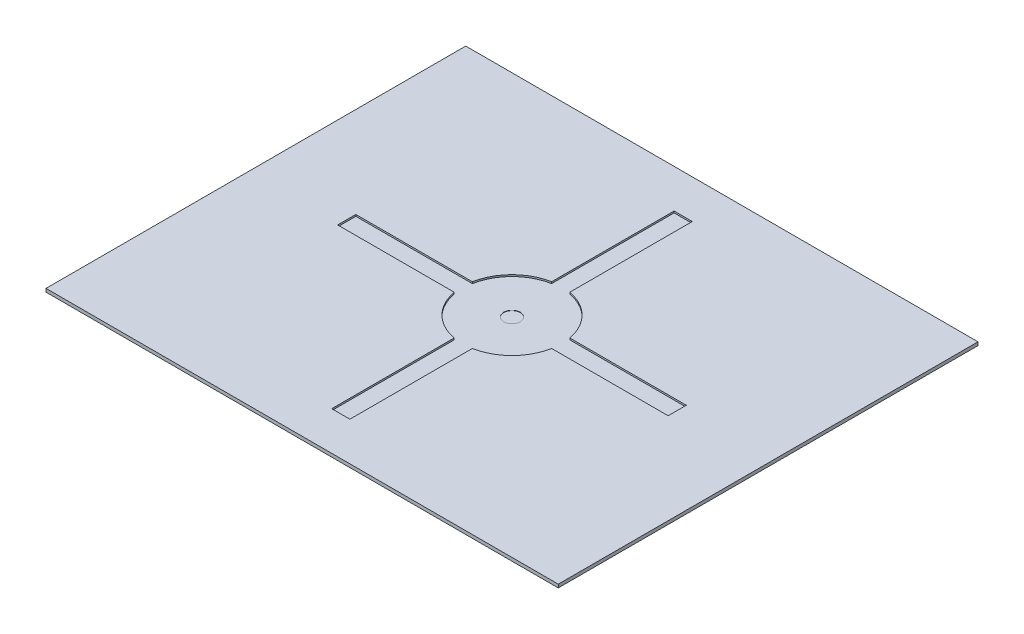
ISO-10303-21;
HEADER;
FILE_DESCRIPTION(('STEP AP214'),'2;1');
FILE_NAME('part.step','',(''),(''),'','','');
FILE_SCHEMA(('AUTOMOTIVE_DESIGN { 1 0 10303 214 1 1 1 1 }'));
ENDSEC;
DATA;
#1=APPLICATION_CONTEXT('core data for automotive mechanical design processes');
#2=APPLICATION_PROTOCOL_DEFINITION('international standard','automotive_design',2000,#1);
#3=PRODUCT_CONTEXT('',#1,'mechanical');
#4=PRODUCT('Part','Part','',(#3));
#5=PRODUCT_RELATED_PRODUCT_CATEGORY('part','',(#4));
#6=PRODUCT_DEFINITION_FORMATION('','',#4);
#7=PRODUCT_DEFINITION_CONTEXT('part definition',#1,'design');
#8=PRODUCT_DEFINITION('design','',#6,#7);
#9=PRODUCT_DEFINITION_SHAPE('','',#8);
#10=(LENGTH_UNIT() NAMED_UNIT(*) SI_UNIT(.MILLI.,.METRE.));
#11=(NAMED_UNIT(*) PLANE_ANGLE_UNIT() SI_UNIT($,.RADIAN.));
#12=(NAMED_UNIT(*) SI_UNIT($,.STERADIAN.) SOLID_ANGLE_UNIT());
#13=UNCERTAINTY_MEASURE_WITH_UNIT(LENGTH_MEASURE(1.E-05),#10,'distance_accuracy_value','');
#14=(GEOMETRIC_REPRESENTATION_CONTEXT(3) GLOBAL_UNCERTAINTY_ASSIGNED_CONTEXT((#13)) GLOBAL_UNIT_ASSIGNED_CONTEXT((#10,
#11,#12)) REPRESENTATION_CONTEXT('',''));
#15=CARTESIAN_POINT('',(0.,0.,0.));
#16=DIRECTION('',(0.,0.,1.));
#17=DIRECTION('',(1.,0.,0.));
#18=AXIS2_PLACEMENT_3D('',#15,#16,#17);
#19=CARTESIAN_POINT('',(77.5,1.,-63.5));
#20=DIRECTION('',(-1.,0.,0.));
#21=DIRECTION('',(0.,0.,1.));
#22=AXIS2_PLACEMENT_3D('',#19,#20,#21);
#23=PLANE('',#22);
#24=DIRECTION('',(0.,0.,-1.));
#25=VECTOR('',#24,1.);
#26=CARTESIAN_POINT('',(77.5,0.,-63.5));
#27=LINE('',#26,#25);
#28=CARTESIAN_POINT('',(77.5,0.,63.5));
#29=VERTEX_POINT('',#28);
#30=CARTESIAN_POINT('',(77.5,0.,-63.5));
#31=VERTEX_POINT('',#30);
#32=EDGE_CURVE('E289',#29,#31,#27,.T.);
#33=ORIENTED_EDGE('',*,*,#32,.T.);
#34=DIRECTION('',(0.,-1.,0.));
#35=VECTOR('',#34,1.);
#36=CARTESIAN_POINT('',(77.5,1.,-63.5));
#37=LINE('',#36,#35);
#38=CARTESIAN_POINT('',(77.5,1.,-63.5));
#39=VERTEX_POINT('',#38);
#40=EDGE_CURVE('E11',#39,#31,#37,.T.);
#41=ORIENTED_EDGE('',*,*,#40,.F.);
#42=DIRECTION('',(0.,0.,-1.));
#43=VECTOR('',#42,1.);
#44=CARTESIAN_POINT('',(77.5,1.,-63.5));
#45=LINE('',#44,#43);
#46=CARTESIAN_POINT('',(77.5,1.,63.5));
#47=VERTEX_POINT('',#46);
#48=EDGE_CURVE('E317',#47,#39,#45,.T.);
#49=ORIENTED_EDGE('',*,*,#48,.F.);
#50=DIRECTION('',(0.,-1.,0.));
#51=VECTOR('',#50,1.);
#52=CARTESIAN_POINT('',(77.5,1.,63.5));
#53=LINE('',#52,#51);
#54=EDGE_CURVE('E323',#47,#29,#53,.T.);
#55=ORIENTED_EDGE('',*,*,#54,.T.);
#56=EDGE_LOOP('',(#33,#41,#49,#55));
#57=FACE_BOUND('',#56,.T.);
#58=ADVANCED_FACE('F33',(#57),#23,.F.);
#59=CARTESIAN_POINT('',(-77.5,1.,-63.5));
#60=DIRECTION('',(0.,0.,1.));
#61=DIRECTION('',(1.,0.,0.));
#62=AXIS2_PLACEMENT_3D('',#59,#60,#61);
#63=PLANE('',#62);
#64=DIRECTION('',(-1.,0.,0.));
#65=VECTOR('',#64,1.);
#66=CARTESIAN_POINT('',(-77.5,0.,-63.5));
#67=LINE('',#66,#65);
#68=CARTESIAN_POINT('',(-77.5,0.,-63.5));
#69=VERTEX_POINT('',#68);
#70=EDGE_CURVE('E326',#31,#69,#67,.T.);
#71=ORIENTED_EDGE('',*,*,#70,.T.);
#72=DIRECTION('',(0.,-1.,0.));
#73=VECTOR('',#72,1.);
#74=CARTESIAN_POINT('',(-77.5,1.,-63.5));
#75=LINE('',#74,#73);
#76=CARTESIAN_POINT('',(-77.5,1.,-63.5));
#77=VERTEX_POINT('',#76);
#78=EDGE_CURVE('E40',#77,#69,#75,.T.);
#79=ORIENTED_EDGE('',*,*,#78,.F.);
#80=DIRECTION('',(-1.,0.,0.));
#81=VECTOR('',#80,1.);
#82=CARTESIAN_POINT('',(-77.5,1.,-63.5));
#83=LINE('',#82,#81);
#84=EDGE_CURVE('E84',#39,#77,#83,.T.);
#85=ORIENTED_EDGE('',*,*,#84,.F.);
#86=ORIENTED_EDGE('',*,*,#40,.T.);
#87=EDGE_LOOP('',(#71,#79,#85,#86));
#88=FACE_BOUND('',#87,.T.);
#89=ADVANCED_FACE('F356',(#88),#63,.F.);
#90=CARTESIAN_POINT('',(-77.5,1.,-63.5));
#91=DIRECTION('',(1.,0.,0.));
#92=DIRECTION('',(0.,0.,-1.));
#93=AXIS2_PLACEMENT_3D('',#90,#91,#92);
#94=PLANE('',#93);
#95=DIRECTION('',(0.,0.,1.));
#96=VECTOR('',#95,1.);
#97=CARTESIAN_POINT('',(-77.5,0.,-63.5));
#98=LINE('',#97,#96);
#99=CARTESIAN_POINT('',(-77.5,0.,63.5));
#100=VERTEX_POINT('',#99);
#101=EDGE_CURVE('E328',#69,#100,#98,.T.);
#102=ORIENTED_EDGE('',*,*,#101,.T.);
#103=DIRECTION('',(0.,-1.,0.));
#104=VECTOR('',#103,1.);
#105=CARTESIAN_POINT('',(-77.5,1.,63.5));
#106=LINE('',#105,#104);
#107=CARTESIAN_POINT('',(-77.5,1.,63.5));
#108=VERTEX_POINT('',#107);
#109=EDGE_CURVE('E332',#108,#100,#106,.T.);
#110=ORIENTED_EDGE('',*,*,#109,.F.);
#111=DIRECTION('',(0.,0.,1.));
#112=VECTOR('',#111,1.);
#113=CARTESIAN_POINT('',(-77.5,1.,-63.5));
#114=LINE('',#113,#112);
#115=EDGE_CURVE('E320',#77,#108,#114,.T.);
#116=ORIENTED_EDGE('',*,*,#115,.F.);
#117=ORIENTED_EDGE('',*,*,#78,.T.);
#118=EDGE_LOOP('',(#102,#110,#116,#117));
#119=FACE_BOUND('',#118,.T.);
#120=ADVANCED_FACE('F337',(#119),#94,.F.);
#121=CARTESIAN_POINT('',(-77.5,1.,63.5));
#122=DIRECTION('',(0.,0.,-1.));
#123=DIRECTION('',(-1.,0.,0.));
#124=AXIS2_PLACEMENT_3D('',#121,#122,#123);
#125=PLANE('',#124);
#126=DIRECTION('',(1.,0.,0.));
#127=VECTOR('',#126,1.);
#128=CARTESIAN_POINT('',(-77.5,0.,63.5));
#129=LINE('',#128,#127);
#130=EDGE_CURVE('E77',#100,#29,#129,.T.);
#131=ORIENTED_EDGE('',*,*,#130,.T.);
#132=ORIENTED_EDGE('',*,*,#54,.F.);
#133=DIRECTION('',(1.,0.,0.));
#134=VECTOR('',#133,1.);
#135=CARTESIAN_POINT('',(-77.5,1.,63.5));
#136=LINE('',#135,#134);
#137=EDGE_CURVE('E56',#108,#47,#136,.T.);
#138=ORIENTED_EDGE('',*,*,#137,.F.);
#139=ORIENTED_EDGE('',*,*,#109,.T.);
#140=EDGE_LOOP('',(#131,#132,#138,#139));
#141=FACE_BOUND('',#140,.T.);
#142=ADVANCED_FACE('F345',(#141),#125,.F.);
#143=CARTESIAN_POINT('',(0.,1.,0.));
#144=DIRECTION('',(0.,1.,0.));
#145=DIRECTION('',(0.,0.,1.));
#146=AXIS2_PLACEMENT_3D('',#143,#144,#145);
#147=PLANE('',#146);
#148=DIRECTION('',(1.,0.,0.));
#149=VECTOR('',#148,1.);
#150=CARTESIAN_POINT('',(14.7457621030586,1.,2.75));
#151=LINE('',#150,#149);
#152=CARTESIAN_POINT('',(14.7457621030586,1.,2.75));
#153=VERTEX_POINT('',#152);
#154=CARTESIAN_POINT('',(50.,1.,2.75));
#155=VERTEX_POINT('',#154);
#156=EDGE_CURVE('E47',#153,#155,#151,.T.);
#157=ORIENTED_EDGE('',*,*,#156,.F.);
#158=CARTESIAN_POINT('',(0.,1.,0.));
#159=DIRECTION('',(0.,1.,0.));
#160=DIRECTION('',(0.,0.,1.));
#161=AXIS2_PLACEMENT_3D('',#158,#159,#160);
#162=CIRCLE('',#161,15.);
#163=CARTESIAN_POINT('',(2.75,1.,14.7457621030586));
#164=VERTEX_POINT('',#163);
#165=EDGE_CURVE('E199',#164,#153,#162,.T.);
#166=ORIENTED_EDGE('',*,*,#165,.F.);
#167=DIRECTION('',(0.,0.,-1.));
#168=VECTOR('',#167,1.);
#169=CARTESIAN_POINT('',(2.75,1.,14.7457621030586));
#170=LINE('',#169,#168);
#171=CARTESIAN_POINT('',(2.75000000000001,1.,51.7988498967456));
#172=VERTEX_POINT('',#171);
#173=EDGE_CURVE('E202',#172,#164,#170,.T.);
#174=ORIENTED_EDGE('',*,*,#173,.F.);
#175=DIRECTION('',(1.,0.,0.));
#176=VECTOR('',#175,1.);
#177=CARTESIAN_POINT('',(-2.74999999999999,1.,51.7988498967456));
#178=LINE('',#177,#176);
#179=CARTESIAN_POINT('',(-2.74999999999999,1.,51.7988498967456));
#180=VERTEX_POINT('',#179);
#181=EDGE_CURVE('E282',#180,#172,#178,.T.);
#182=ORIENTED_EDGE('',*,*,#181,.F.);
#183=DIRECTION('',(0.,0.,1.));
#184=VECTOR('',#183,1.);
#185=CARTESIAN_POINT('',(-2.75,1.,14.7457621030586));
#186=LINE('',#185,#184);
#187=CARTESIAN_POINT('',(-2.75000000000001,1.,14.7457621030586));
#188=VERTEX_POINT('',#187);
#189=EDGE_CURVE('E279',#188,#180,#186,.T.);
#190=ORIENTED_EDGE('',*,*,#189,.F.);
#191=CARTESIAN_POINT('',(0.,1.,0.));
#192=DIRECTION('',(0.,1.,0.));
#193=DIRECTION('',(0.,0.,1.));
#194=AXIS2_PLACEMENT_3D('',#191,#192,#193);
#195=CIRCLE('',#194,15.);
#196=CARTESIAN_POINT('',(-14.7457621030586,1.,2.75));
#197=VERTEX_POINT('',#196);
#198=EDGE_CURVE('E276',#197,#188,#195,.T.);
#199=ORIENTED_EDGE('',*,*,#198,.F.);
#200=DIRECTION('',(1.,0.,0.));
#201=VECTOR('',#200,1.);
#202=CARTESIAN_POINT('',(-50.,1.,2.75));
#203=LINE('',#202,#201);
#204=CARTESIAN_POINT('',(-50.,1.,2.75));
#205=VERTEX_POINT('',#204);
#206=EDGE_CURVE('E273',#205,#197,#203,.T.);
#207=ORIENTED_EDGE('',*,*,#206,.F.);
#208=DIRECTION('',(0.,0.,1.));
#209=VECTOR('',#208,1.);
#210=CARTESIAN_POINT('',(-50.,1.,-2.75));
#211=LINE('',#210,#209);
#212=CARTESIAN_POINT('',(-50.,1.,-2.75));
#213=VERTEX_POINT('',#212);
#214=EDGE_CURVE('E270',#213,#205,#211,.T.);
#215=ORIENTED_EDGE('',*,*,#214,.F.);
#216=DIRECTION('',(-1.,0.,0.));
#217=VECTOR('',#216,1.);
#218=CARTESIAN_POINT('',(-50.,1.,-2.75));
#219=LINE('',#218,#217);
#220=CARTESIAN_POINT('',(-14.7457621030586,1.,-2.75));
#221=VERTEX_POINT('',#220);
#222=EDGE_CURVE('E267',#221,#213,#219,.T.);
#223=ORIENTED_EDGE('',*,*,#222,.F.);
#224=CARTESIAN_POINT('',(0.,1.,0.));
#225=DIRECTION('',(0.,1.,0.));
#226=DIRECTION('',(0.,0.,1.));
#227=AXIS2_PLACEMENT_3D('',#224,#225,#226);
#228=CIRCLE('',#227,15.);
#229=CARTESIAN_POINT('',(-2.75,1.,-14.7457621030586));
#230=VERTEX_POINT('',#229);
#231=EDGE_CURVE('E264',#230,#221,#228,.T.);
#232=ORIENTED_EDGE('',*,*,#231,.F.);
#233=DIRECTION('',(0.,0.,1.));
#234=VECTOR('',#233,1.);
#235=CARTESIAN_POINT('',(-2.75000000000001,1.,-51.7988498967456));
#236=LINE('',#235,#234);
#237=CARTESIAN_POINT('',(-2.75000000000001,1.,-51.7988498967456));
#238=VERTEX_POINT('',#237);
#239=EDGE_CURVE('E261',#238,#230,#236,.T.);
#240=ORIENTED_EDGE('',*,*,#239,.F.);
#241=DIRECTION('',(-1.,0.,0.));
#242=VECTOR('',#241,1.);
#243=CARTESIAN_POINT('',(-2.75000000000001,1.,-51.7988498967456));
#244=LINE('',#243,#242);
#245=CARTESIAN_POINT('',(2.74999999999999,1.,-51.7988498967456));
#246=VERTEX_POINT('',#245);
#247=EDGE_CURVE('E258',#246,#238,#244,.T.);
#248=ORIENTED_EDGE('',*,*,#247,.F.);
#249=DIRECTION('',(0.,0.,-1.));
#250=VECTOR('',#249,1.);
#251=CARTESIAN_POINT('',(2.74999999999999,1.,-51.7988498967456));
#252=LINE('',#251,#250);
#253=CARTESIAN_POINT('',(2.75,1.,-14.7457621030586));
#254=VERTEX_POINT('',#253);
#255=EDGE_CURVE('E255',#254,#246,#252,.T.);
#256=ORIENTED_EDGE('',*,*,#255,.F.);
#257=CARTESIAN_POINT('',(0.,1.,0.));
#258=DIRECTION('',(0.,1.,0.));
#259=DIRECTION('',(0.,0.,1.));
#260=AXIS2_PLACEMENT_3D('',#257,#258,#259);
#261=CIRCLE('',#260,15.);
#262=CARTESIAN_POINT('',(14.7457621030586,1.,-2.75));
#263=VERTEX_POINT('',#262);
#264=EDGE_CURVE('E252',#263,#254,#261,.T.);
#265=ORIENTED_EDGE('',*,*,#264,.F.);
#266=DIRECTION('',(-1.,0.,0.));
#267=VECTOR('',#266,1.);
#268=CARTESIAN_POINT('',(14.7457621030586,1.,-2.75));
#269=LINE('',#268,#267);
#270=CARTESIAN_POINT('',(50.,1.,-2.75));
#271=VERTEX_POINT('',#270);
#272=EDGE_CURVE('E249',#271,#263,#269,.T.);
#273=ORIENTED_EDGE('',*,*,#272,.F.);
#274=DIRECTION('',(0.,0.,-1.));
#275=VECTOR('',#274,1.);
#276=CARTESIAN_POINT('',(50.,1.,-2.75));
#277=LINE('',#276,#275);
#278=EDGE_CURVE('E246',#155,#271,#277,.T.);
#279=ORIENTED_EDGE('',*,*,#278,.F.);
#280=EDGE_LOOP('',(#157,#166,#174,#182,#190,#199,#207,#215,#223,#232,#240,#248,#256,#265,#273,#279));
#281=FACE_BOUND('',#280,.T.);
#282=ORIENTED_EDGE('',*,*,#48,.T.);
#283=ORIENTED_EDGE('',*,*,#84,.T.);
#284=ORIENTED_EDGE('',*,*,#115,.T.);
#285=ORIENTED_EDGE('',*,*,#137,.T.);
#286=EDGE_LOOP('',(#282,#283,#284,#285));
#287=FACE_BOUND('',#286,.T.);
#288=ADVANCED_FACE('F347',(#281,#287),#147,.T.);
#289=CARTESIAN_POINT('',(0.,0.,0.));
#290=DIRECTION('',(0.,1.,0.));
#291=DIRECTION('',(0.,0.,1.));
#292=AXIS2_PLACEMENT_3D('',#289,#290,#291);
#293=PLANE('',#292);
#294=ORIENTED_EDGE('',*,*,#32,.F.);
#295=ORIENTED_EDGE('',*,*,#130,.F.);
#296=ORIENTED_EDGE('',*,*,#101,.F.);
#297=ORIENTED_EDGE('',*,*,#70,.F.);
#298=EDGE_LOOP('',(#294,#295,#296,#297));
#299=FACE_BOUND('',#298,.T.);
#300=ADVANCED_FACE('F341',(#299),#293,.F.);
#301=CARTESIAN_POINT('',(14.7457621030586,0.5,2.75));
#302=DIRECTION('',(0.,0.,1.));
#303=DIRECTION('',(1.,0.,0.));
#304=AXIS2_PLACEMENT_3D('',#301,#302,#303);
#305=PLANE('',#304);
#306=ORIENTED_EDGE('',*,*,#156,.T.);
#307=DIRECTION('',(0.,1.,0.));
#308=VECTOR('',#307,1.);
#309=CARTESIAN_POINT('',(50.,0.5,2.75));
#310=LINE('',#309,#308);
#311=CARTESIAN_POINT('',(50.,0.5,2.75));
#312=VERTEX_POINT('',#311);
#313=EDGE_CURVE('E176',#312,#155,#310,.T.);
#314=ORIENTED_EDGE('',*,*,#313,.F.);
#315=DIRECTION('',(1.,0.,0.));
#316=VECTOR('',#315,1.);
#317=CARTESIAN_POINT('',(14.7457621030586,0.5,2.75));
#318=LINE('',#317,#316);
#319=CARTESIAN_POINT('',(14.7457621030586,0.5,2.75));
#320=VERTEX_POINT('',#319);
#321=EDGE_CURVE('E180',#320,#312,#318,.T.);
#322=ORIENTED_EDGE('',*,*,#321,.F.);
#323=DIRECTION('',(0.,1.,0.));
#324=VECTOR('',#323,1.);
#325=CARTESIAN_POINT('',(14.7457621030586,0.5,2.75));
#326=LINE('',#325,#324);
#327=EDGE_CURVE('E287',#320,#153,#326,.T.);
#328=ORIENTED_EDGE('',*,*,#327,.T.);
#329=EDGE_LOOP('',(#306,#314,#322,#328));
#330=FACE_BOUND('',#329,.T.);
#331=ADVANCED_FACE('F178',(#330),#305,.F.);
#332=CARTESIAN_POINT('',(0.,0.5,0.));
#333=DIRECTION('',(0.,1.,0.));
#334=DIRECTION('',(0.,0.,1.));
#335=AXIS2_PLACEMENT_3D('',#332,#333,#334);
#336=CYLINDRICAL_SURFACE('',#335,15.);
#337=ORIENTED_EDGE('',*,*,#165,.T.);
#338=ORIENTED_EDGE('',*,*,#327,.F.);
#339=CARTESIAN_POINT('',(0.,0.5,0.));
#340=DIRECTION('',(0.,1.,0.));
#341=DIRECTION('',(0.,0.,1.));
#342=AXIS2_PLACEMENT_3D('',#339,#340,#341);
#343=CIRCLE('',#342,15.);
#344=CARTESIAN_POINT('',(2.75,0.5,14.7457621030586));
#345=VERTEX_POINT('',#344);
#346=EDGE_CURVE('E186',#345,#320,#343,.T.);
#347=ORIENTED_EDGE('',*,*,#346,.F.);
#348=DIRECTION('',(0.,1.,0.));
#349=VECTOR('',#348,1.);
#350=CARTESIAN_POINT('',(2.75,0.5,14.7457621030586));
#351=LINE('',#350,#349);
#352=EDGE_CURVE('E290',#345,#164,#351,.T.);
#353=ORIENTED_EDGE('',*,*,#352,.T.);
#354=EDGE_LOOP('',(#337,#338,#347,#353));
#355=FACE_BOUND('',#354,.T.);
#356=ADVANCED_FACE('F392',(#355),#336,.F.);
#357=CARTESIAN_POINT('',(2.75,0.5,14.7457621030586));
#358=DIRECTION('',(1.,0.,0.));
#359=DIRECTION('',(0.,0.,-1.));
#360=AXIS2_PLACEMENT_3D('',#357,#358,#359);
#361=PLANE('',#360);
#362=ORIENTED_EDGE('',*,*,#173,.T.);
#363=ORIENTED_EDGE('',*,*,#352,.F.);
#364=DIRECTION('',(0.,0.,-1.));
#365=VECTOR('',#364,1.);
#366=CARTESIAN_POINT('',(2.75,0.5,14.7457621030586));
#367=LINE('',#366,#365);
#368=CARTESIAN_POINT('',(2.75000000000001,0.5,51.7988498967456));
#369=VERTEX_POINT('',#368);
#370=EDGE_CURVE('E242',#369,#345,#367,.T.);
#371=ORIENTED_EDGE('',*,*,#370,.F.);
#372=DIRECTION('',(0.,1.,0.));
#373=VECTOR('',#372,1.);
#374=CARTESIAN_POINT('',(2.75000000000001,0.5,51.7988498967456));
#375=LINE('',#374,#373);
#376=EDGE_CURVE('E292',#369,#172,#375,.T.);
#377=ORIENTED_EDGE('',*,*,#376,.T.);
#378=EDGE_LOOP('',(#362,#363,#371,#377));
#379=FACE_BOUND('',#378,.T.);
#380=ADVANCED_FACE('F401',(#379),#361,.F.);
#381=CARTESIAN_POINT('',(-2.74999999999999,0.5,51.7988498967456));
#382=DIRECTION('',(0.,0.,1.));
#383=DIRECTION('',(1.,0.,0.));
#384=AXIS2_PLACEMENT_3D('',#381,#382,#383);
#385=PLANE('',#384);
#386=ORIENTED_EDGE('',*,*,#181,.T.);
#387=ORIENTED_EDGE('',*,*,#376,.F.);
#388=DIRECTION('',(1.,0.,0.));
#389=VECTOR('',#388,1.);
#390=CARTESIAN_POINT('',(-2.74999999999999,0.5,51.7988498967456));
#391=LINE('',#390,#389);
#392=CARTESIAN_POINT('',(-2.74999999999999,0.5,51.7988498967456));
#393=VERTEX_POINT('',#392);
#394=EDGE_CURVE('E239',#393,#369,#391,.T.);
#395=ORIENTED_EDGE('',*,*,#394,.F.);
#396=DIRECTION('',(0.,1.,0.));
#397=VECTOR('',#396,1.);
#398=CARTESIAN_POINT('',(-2.74999999999999,0.5,51.7988498967456));
#399=LINE('',#398,#397);
#400=EDGE_CURVE('E294',#393,#180,#399,.T.);
#401=ORIENTED_EDGE('',*,*,#400,.T.);
#402=EDGE_LOOP('',(#386,#387,#395,#401));
#403=FACE_BOUND('',#402,.T.);
#404=ADVANCED_FACE('F411',(#403),#385,.F.);
#405=CARTESIAN_POINT('',(-2.75,0.5,14.7457621030586));
#406=DIRECTION('',(-1.,0.,0.));
#407=DIRECTION('',(0.,0.,1.));
#408=AXIS2_PLACEMENT_3D('',#405,#406,#407);
#409=PLANE('',#408);
#410=ORIENTED_EDGE('',*,*,#189,.T.);
#411=ORIENTED_EDGE('',*,*,#400,.F.);
#412=DIRECTION('',(0.,0.,1.));
#413=VECTOR('',#412,1.);
#414=CARTESIAN_POINT('',(-2.75,0.5,14.7457621030586));
#415=LINE('',#414,#413);
#416=CARTESIAN_POINT('',(-2.75000000000001,0.5,14.7457621030586));
#417=VERTEX_POINT('',#416);
#418=EDGE_CURVE('E236',#417,#393,#415,.T.);
#419=ORIENTED_EDGE('',*,*,#418,.F.);
#420=DIRECTION('',(0.,1.,0.));
#421=VECTOR('',#420,1.);
#422=CARTESIAN_POINT('',(-2.75000000000001,0.5,14.7457621030586));
#423=LINE('',#422,#421);
#424=EDGE_CURVE('E296',#417,#188,#423,.T.);
#425=ORIENTED_EDGE('',*,*,#424,.T.);
#426=EDGE_LOOP('',(#410,#411,#419,#425));
#427=FACE_BOUND('',#426,.T.);
#428=ADVANCED_FACE('F421',(#427),#409,.F.);
#429=CARTESIAN_POINT('',(0.,0.5,0.));
#430=DIRECTION('',(0.,1.,0.));
#431=DIRECTION('',(0.,0.,1.));
#432=AXIS2_PLACEMENT_3D('',#429,#430,#431);
#433=CYLINDRICAL_SURFACE('',#432,15.);
#434=ORIENTED_EDGE('',*,*,#198,.T.);
#435=ORIENTED_EDGE('',*,*,#424,.F.);
#436=CARTESIAN_POINT('',(0.,0.5,0.));
#437=DIRECTION('',(0.,1.,0.));
#438=DIRECTION('',(0.,0.,1.));
#439=AXIS2_PLACEMENT_3D('',#436,#437,#438);
#440=CIRCLE('',#439,15.);
#441=CARTESIAN_POINT('',(-14.7457621030586,0.5,2.75));
#442=VERTEX_POINT('',#441);
#443=EDGE_CURVE('E233',#442,#417,#440,.T.);
#444=ORIENTED_EDGE('',*,*,#443,.F.);
#445=DIRECTION('',(0.,1.,0.));
#446=VECTOR('',#445,1.);
#447=CARTESIAN_POINT('',(-14.7457621030586,0.5,2.75));
#448=LINE('',#447,#446);
#449=EDGE_CURVE('E298',#442,#197,#448,.T.);
#450=ORIENTED_EDGE('',*,*,#449,.T.);
#451=EDGE_LOOP('',(#434,#435,#444,#450));
#452=FACE_BOUND('',#451,.T.);
#453=ADVANCED_FACE('F431',(#452),#433,.F.);
#454=CARTESIAN_POINT('',(-50.,0.5,2.75));
#455=DIRECTION('',(0.,0.,1.));
#456=DIRECTION('',(1.,0.,0.));
#457=AXIS2_PLACEMENT_3D('',#454,#455,#456);
#458=PLANE('',#457);
#459=ORIENTED_EDGE('',*,*,#206,.T.);
#460=ORIENTED_EDGE('',*,*,#449,.F.);
#461=DIRECTION('',(1.,0.,0.));
#462=VECTOR('',#461,1.);
#463=CARTESIAN_POINT('',(-50.,0.5,2.75));
#464=LINE('',#463,#462);
#465=CARTESIAN_POINT('',(-50.,0.5,2.75));
#466=VERTEX_POINT('',#465);
#467=EDGE_CURVE('E230',#466,#442,#464,.T.);
#468=ORIENTED_EDGE('',*,*,#467,.F.);
#469=DIRECTION('',(0.,1.,0.));
#470=VECTOR('',#469,1.);
#471=CARTESIAN_POINT('',(-50.,0.5,2.75));
#472=LINE('',#471,#470);
#473=EDGE_CURVE('E300',#466,#205,#472,.T.);
#474=ORIENTED_EDGE('',*,*,#473,.T.);
#475=EDGE_LOOP('',(#459,#460,#468,#474));
#476=FACE_BOUND('',#475,.T.);
#477=ADVANCED_FACE('F441',(#476),#458,.F.);
#478=CARTESIAN_POINT('',(-50.,0.5,-2.75));
#479=DIRECTION('',(-1.,0.,0.));
#480=DIRECTION('',(0.,0.,1.));
#481=AXIS2_PLACEMENT_3D('',#478,#479,#480);
#482=PLANE('',#481);
#483=ORIENTED_EDGE('',*,*,#214,.T.);
#484=ORIENTED_EDGE('',*,*,#473,.F.);
#485=DIRECTION('',(0.,0.,1.));
#486=VECTOR('',#485,1.);
#487=CARTESIAN_POINT('',(-50.,0.5,-2.75));
#488=LINE('',#487,#486);
#489=CARTESIAN_POINT('',(-50.,0.5,-2.75));
#490=VERTEX_POINT('',#489);
#491=EDGE_CURVE('E227',#490,#466,#488,.T.);
#492=ORIENTED_EDGE('',*,*,#491,.F.);
#493=DIRECTION('',(0.,1.,0.));
#494=VECTOR('',#493,1.);
#495=CARTESIAN_POINT('',(-50.,0.5,-2.75));
#496=LINE('',#495,#494);
#497=EDGE_CURVE('E302',#490,#213,#496,.T.);
#498=ORIENTED_EDGE('',*,*,#497,.T.);
#499=EDGE_LOOP('',(#483,#484,#492,#498));
#500=FACE_BOUND('',#499,.T.);
#501=ADVANCED_FACE('F451',(#500),#482,.F.);
#502=CARTESIAN_POINT('',(-50.,0.5,-2.75));
#503=DIRECTION('',(0.,0.,-1.));
#504=DIRECTION('',(-1.,0.,0.));
#505=AXIS2_PLACEMENT_3D('',#502,#503,#504);
#506=PLANE('',#505);
#507=ORIENTED_EDGE('',*,*,#222,.T.);
#508=ORIENTED_EDGE('',*,*,#497,.F.);
#509=DIRECTION('',(-1.,0.,0.));
#510=VECTOR('',#509,1.);
#511=CARTESIAN_POINT('',(-50.,0.5,-2.75));
#512=LINE('',#511,#510);
#513=CARTESIAN_POINT('',(-14.7457621030586,0.5,-2.75));
#514=VERTEX_POINT('',#513);
#515=EDGE_CURVE('E224',#514,#490,#512,.T.);
#516=ORIENTED_EDGE('',*,*,#515,.F.);
#517=DIRECTION('',(0.,1.,0.));
#518=VECTOR('',#517,1.);
#519=CARTESIAN_POINT('',(-14.7457621030586,0.5,-2.75));
#520=LINE('',#519,#518);
#521=EDGE_CURVE('E304',#514,#221,#520,.T.);
#522=ORIENTED_EDGE('',*,*,#521,.T.);
#523=EDGE_LOOP('',(#507,#508,#516,#522));
#524=FACE_BOUND('',#523,.T.);
#525=ADVANCED_FACE('F461',(#524),#506,.F.);
#526=CARTESIAN_POINT('',(0.,0.5,0.));
#527=DIRECTION('',(0.,1.,0.));
#528=DIRECTION('',(0.,0.,1.));
#529=AXIS2_PLACEMENT_3D('',#526,#527,#528);
#530=CYLINDRICAL_SURFACE('',#529,15.);
#531=ORIENTED_EDGE('',*,*,#231,.T.);
#532=ORIENTED_EDGE('',*,*,#521,.F.);
#533=CARTESIAN_POINT('',(0.,0.5,0.));
#534=DIRECTION('',(0.,1.,0.));
#535=DIRECTION('',(0.,0.,1.));
#536=AXIS2_PLACEMENT_3D('',#533,#534,#535);
#537=CIRCLE('',#536,15.);
#538=CARTESIAN_POINT('',(-2.75,0.5,-14.7457621030586));
#539=VERTEX_POINT('',#538);
#540=EDGE_CURVE('E221',#539,#514,#537,.T.);
#541=ORIENTED_EDGE('',*,*,#540,.F.);
#542=DIRECTION('',(0.,1.,0.));
#543=VECTOR('',#542,1.);
#544=CARTESIAN_POINT('',(-2.75,0.5,-14.7457621030586));
#545=LINE('',#544,#543);
#546=EDGE_CURVE('E306',#539,#230,#545,.T.);
#547=ORIENTED_EDGE('',*,*,#546,.T.);
#548=EDGE_LOOP('',(#531,#532,#541,#547));
#549=FACE_BOUND('',#548,.T.);
#550=ADVANCED_FACE('F471',(#549),#530,.F.);
#551=CARTESIAN_POINT('',(-2.75000000000001,0.5,-51.7988498967456));
#552=DIRECTION('',(-1.,0.,0.));
#553=DIRECTION('',(0.,0.,1.));
#554=AXIS2_PLACEMENT_3D('',#551,#552,#553);
#555=PLANE('',#554);
#556=ORIENTED_EDGE('',*,*,#239,.T.);
#557=ORIENTED_EDGE('',*,*,#546,.F.);
#558=DIRECTION('',(0.,0.,1.));
#559=VECTOR('',#558,1.);
#560=CARTESIAN_POINT('',(-2.75000000000001,0.5,-51.7988498967456));
#561=LINE('',#560,#559);
#562=CARTESIAN_POINT('',(-2.75000000000001,0.5,-51.7988498967456));
#563=VERTEX_POINT('',#562);
#564=EDGE_CURVE('E218',#563,#539,#561,.T.);
#565=ORIENTED_EDGE('',*,*,#564,.F.);
#566=DIRECTION('',(0.,1.,0.));
#567=VECTOR('',#566,1.);
#568=CARTESIAN_POINT('',(-2.75000000000001,0.5,-51.7988498967456));
#569=LINE('',#568,#567);
#570=EDGE_CURVE('E308',#563,#238,#569,.T.);
#571=ORIENTED_EDGE('',*,*,#570,.T.);
#572=EDGE_LOOP('',(#556,#557,#565,#571));
#573=FACE_BOUND('',#572,.T.);
#574=ADVANCED_FACE('F481',(#573),#555,.F.);
#575=CARTESIAN_POINT('',(-2.75000000000001,0.5,-51.7988498967456));
#576=DIRECTION('',(0.,0.,-1.));
#577=DIRECTION('',(-1.,0.,0.));
#578=AXIS2_PLACEMENT_3D('',#575,#576,#577);
#579=PLANE('',#578);
#580=ORIENTED_EDGE('',*,*,#247,.T.);
#581=ORIENTED_EDGE('',*,*,#570,.F.);
#582=DIRECTION('',(-1.,0.,0.));
#583=VECTOR('',#582,1.);
#584=CARTESIAN_POINT('',(-2.75000000000001,0.5,-51.7988498967456));
#585=LINE('',#584,#583);
#586=CARTESIAN_POINT('',(2.74999999999999,0.5,-51.7988498967456));
#587=VERTEX_POINT('',#586);
#588=EDGE_CURVE('E215',#587,#563,#585,.T.);
#589=ORIENTED_EDGE('',*,*,#588,.F.);
#590=DIRECTION('',(0.,1.,0.));
#591=VECTOR('',#590,1.);
#592=CARTESIAN_POINT('',(2.74999999999999,0.5,-51.7988498967456));
#593=LINE('',#592,#591);
#594=EDGE_CURVE('E310',#587,#246,#593,.T.);
#595=ORIENTED_EDGE('',*,*,#594,.T.);
#596=EDGE_LOOP('',(#580,#581,#589,#595));
#597=FACE_BOUND('',#596,.T.);
#598=ADVANCED_FACE('F491',(#597),#579,.F.);
#599=CARTESIAN_POINT('',(2.74999999999999,0.5,-51.7988498967456));
#600=DIRECTION('',(1.,0.,0.));
#601=DIRECTION('',(0.,0.,-1.));
#602=AXIS2_PLACEMENT_3D('',#599,#600,#601);
#603=PLANE('',#602);
#604=ORIENTED_EDGE('',*,*,#255,.T.);
#605=ORIENTED_EDGE('',*,*,#594,.F.);
#606=DIRECTION('',(0.,0.,-1.));
#607=VECTOR('',#606,1.);
#608=CARTESIAN_POINT('',(2.74999999999999,0.5,-51.7988498967456));
#609=LINE('',#608,#607);
#610=CARTESIAN_POINT('',(2.75,0.5,-14.7457621030586));
#611=VERTEX_POINT('',#610);
#612=EDGE_CURVE('E212',#611,#587,#609,.T.);
#613=ORIENTED_EDGE('',*,*,#612,.F.);
#614=DIRECTION('',(0.,1.,0.));
#615=VECTOR('',#614,1.);
#616=CARTESIAN_POINT('',(2.75,0.5,-14.7457621030586));
#617=LINE('',#616,#615);
#618=EDGE_CURVE('E312',#611,#254,#617,.T.);
#619=ORIENTED_EDGE('',*,*,#618,.T.);
#620=EDGE_LOOP('',(#604,#605,#613,#619));
#621=FACE_BOUND('',#620,.T.);
#622=ADVANCED_FACE('F501',(#621),#603,.F.);
#623=CARTESIAN_POINT('',(0.,0.5,0.));
#624=DIRECTION('',(0.,1.,0.));
#625=DIRECTION('',(0.,0.,1.));
#626=AXIS2_PLACEMENT_3D('',#623,#624,#625);
#627=CYLINDRICAL_SURFACE('',#626,15.);
#628=ORIENTED_EDGE('',*,*,#264,.T.);
#629=ORIENTED_EDGE('',*,*,#618,.F.);
#630=CARTESIAN_POINT('',(0.,0.5,0.));
#631=DIRECTION('',(0.,1.,0.));
#632=DIRECTION('',(0.,0.,1.));
#633=AXIS2_PLACEMENT_3D('',#630,#631,#632);
#634=CIRCLE('',#633,15.);
#635=CARTESIAN_POINT('',(14.7457621030586,0.5,-2.75));
#636=VERTEX_POINT('',#635);
#637=EDGE_CURVE('E209',#636,#611,#634,.T.);
#638=ORIENTED_EDGE('',*,*,#637,.F.);
#639=DIRECTION('',(0.,1.,0.));
#640=VECTOR('',#639,1.);
#641=CARTESIAN_POINT('',(14.7457621030586,0.5,-2.75));
#642=LINE('',#641,#640);
#643=EDGE_CURVE('E314',#636,#263,#642,.T.);
#644=ORIENTED_EDGE('',*,*,#643,.T.);
#645=EDGE_LOOP('',(#628,#629,#638,#644));
#646=FACE_BOUND('',#645,.T.);
#647=ADVANCED_FACE('F511',(#646),#627,.F.);
#648=CARTESIAN_POINT('',(14.7457621030586,0.5,-2.75));
#649=DIRECTION('',(0.,0.,-1.));
#650=DIRECTION('',(-1.,0.,0.));
#651=AXIS2_PLACEMENT_3D('',#648,#649,#650);
#652=PLANE('',#651);
#653=ORIENTED_EDGE('',*,*,#272,.T.);
#654=ORIENTED_EDGE('',*,*,#643,.F.);
#655=DIRECTION('',(-1.,0.,0.));
#656=VECTOR('',#655,1.);
#657=CARTESIAN_POINT('',(14.7457621030586,0.5,-2.75));
#658=LINE('',#657,#656);
#659=CARTESIAN_POINT('',(50.,0.5,-2.75));
#660=VERTEX_POINT('',#659);
#661=EDGE_CURVE('E194',#660,#636,#658,.T.);
#662=ORIENTED_EDGE('',*,*,#661,.F.);
#663=DIRECTION('',(0.,1.,0.));
#664=VECTOR('',#663,1.);
#665=CARTESIAN_POINT('',(50.,0.5,-2.75));
#666=LINE('',#665,#664);
#667=EDGE_CURVE('E185',#660,#271,#666,.T.);
#668=ORIENTED_EDGE('',*,*,#667,.T.);
#669=EDGE_LOOP('',(#653,#654,#662,#668));
#670=FACE_BOUND('',#669,.T.);
#671=ADVANCED_FACE('F521',(#670),#652,.F.);
#672=CARTESIAN_POINT('',(50.,0.5,-2.75));
#673=DIRECTION('',(1.,0.,0.));
#674=DIRECTION('',(0.,0.,-1.));
#675=AXIS2_PLACEMENT_3D('',#672,#673,#674);
#676=PLANE('',#675);
#677=ORIENTED_EDGE('',*,*,#278,.T.);
#678=ORIENTED_EDGE('',*,*,#667,.F.);
#679=DIRECTION('',(0.,0.,-1.));
#680=VECTOR('',#679,1.);
#681=CARTESIAN_POINT('',(50.,0.5,-2.75));
#682=LINE('',#681,#680);
#683=EDGE_CURVE('E189',#312,#660,#682,.T.);
#684=ORIENTED_EDGE('',*,*,#683,.F.);
#685=ORIENTED_EDGE('',*,*,#313,.T.);
#686=EDGE_LOOP('',(#677,#678,#684,#685));
#687=FACE_BOUND('',#686,.T.);
#688=ADVANCED_FACE('F190',(#687),#676,.F.);
#689=CARTESIAN_POINT('',(0.,0.5,0.));
#690=DIRECTION('',(0.,1.,0.));
#691=DIRECTION('',(0.,0.,1.));
#692=AXIS2_PLACEMENT_3D('',#689,#690,#691);
#693=PLANE('',#692);
#694=CARTESIAN_POINT('',(0.,0.5,0.));
#695=DIRECTION('',(0.,1.,0.));
#696=DIRECTION('',(0.,0.,1.));
#697=AXIS2_PLACEMENT_3D('',#694,#695,#696);
#698=CIRCLE('',#697,2.5);
#699=CARTESIAN_POINT('',(0.,0.5,2.5));
#700=VERTEX_POINT('',#699);
#701=EDGE_CURVE('E205',#700,#700,#698,.T.);
#702=ORIENTED_EDGE('',*,*,#701,.F.);
#703=EDGE_LOOP('',(#702));
#704=FACE_BOUND('',#703,.T.);
#705=ORIENTED_EDGE('',*,*,#321,.T.);
#706=ORIENTED_EDGE('',*,*,#683,.T.);
#707=ORIENTED_EDGE('',*,*,#661,.T.);
#708=ORIENTED_EDGE('',*,*,#637,.T.);
#709=ORIENTED_EDGE('',*,*,#612,.T.);
#710=ORIENTED_EDGE('',*,*,#588,.T.);
#711=ORIENTED_EDGE('',*,*,#564,.T.);
#712=ORIENTED_EDGE('',*,*,#540,.T.);
#713=ORIENTED_EDGE('',*,*,#515,.T.);
#714=ORIENTED_EDGE('',*,*,#491,.T.);
#715=ORIENTED_EDGE('',*,*,#467,.T.);
#716=ORIENTED_EDGE('',*,*,#443,.T.);
#717=ORIENTED_EDGE('',*,*,#418,.T.);
#718=ORIENTED_EDGE('',*,*,#394,.T.);
#719=ORIENTED_EDGE('',*,*,#370,.T.);
#720=ORIENTED_EDGE('',*,*,#346,.T.);
#721=EDGE_LOOP('',(#705,#706,#707,#708,#709,#710,#711,#712,#713,#714,#715,#716,#717,#718,#719,#720));
#722=FACE_BOUND('',#721,.T.);
#723=ADVANCED_FACE('F196',(#704,#722),#693,.T.);
#724=CARTESIAN_POINT('',(0.,0.4,0.));
#725=DIRECTION('',(0.,1.,0.));
#726=DIRECTION('',(0.,0.,1.));
#727=AXIS2_PLACEMENT_3D('',#724,#725,#726);
#728=CYLINDRICAL_SURFACE('',#727,2.5);
#729=CARTESIAN_POINT('',(0.,0.4,0.));
#730=DIRECTION('',(0.,1.,0.));
#731=DIRECTION('',(0.,0.,1.));
#732=AXIS2_PLACEMENT_3D('',#729,#730,#731);
#733=CIRCLE('',#732,2.5);
#734=CARTESIAN_POINT('',(0.,0.4,2.5));
#735=VERTEX_POINT('',#734);
#736=EDGE_CURVE('E247',#735,#735,#733,.T.);
#737=ORIENTED_EDGE('',*,*,#736,.F.);
#738=EDGE_LOOP('',(#737));
#739=FACE_BOUND('',#738,.T.);
#740=ORIENTED_EDGE('',*,*,#701,.T.);
#741=EDGE_LOOP('',(#740));
#742=FACE_BOUND('',#741,.T.);
#743=ADVANCED_FACE('F548',(#739,#742),#728,.F.);
#744=CARTESIAN_POINT('',(0.,0.4,0.));
#745=DIRECTION('',(0.,1.,0.));
#746=DIRECTION('',(0.,0.,1.));
#747=AXIS2_PLACEMENT_3D('',#744,#745,#746);
#748=PLANE('',#747);
#749=ORIENTED_EDGE('',*,*,#736,.T.);
#750=EDGE_LOOP('',(#749));
#751=FACE_BOUND('',#750,.T.);
#752=ADVANCED_FACE('F558',(#751),#748,.T.);
#753=CLOSED_SHELL('',(#58,#89,#120,#142,#288,#300,#331,#356,#380,#404,#428,#453,#477,#501,#525,
#550,#574,#598,#622,#647,#671,#688,#723,#743,#752));
#754=MANIFOLD_SOLID_BREP('B2',#753);
#755=ADVANCED_BREP_SHAPE_REPRESENTATION('',(#18,#754),#14);
#756=SHAPE_DEFINITION_REPRESENTATION(#9,#755);
ENDSEC;
END-ISO-10303-21;
